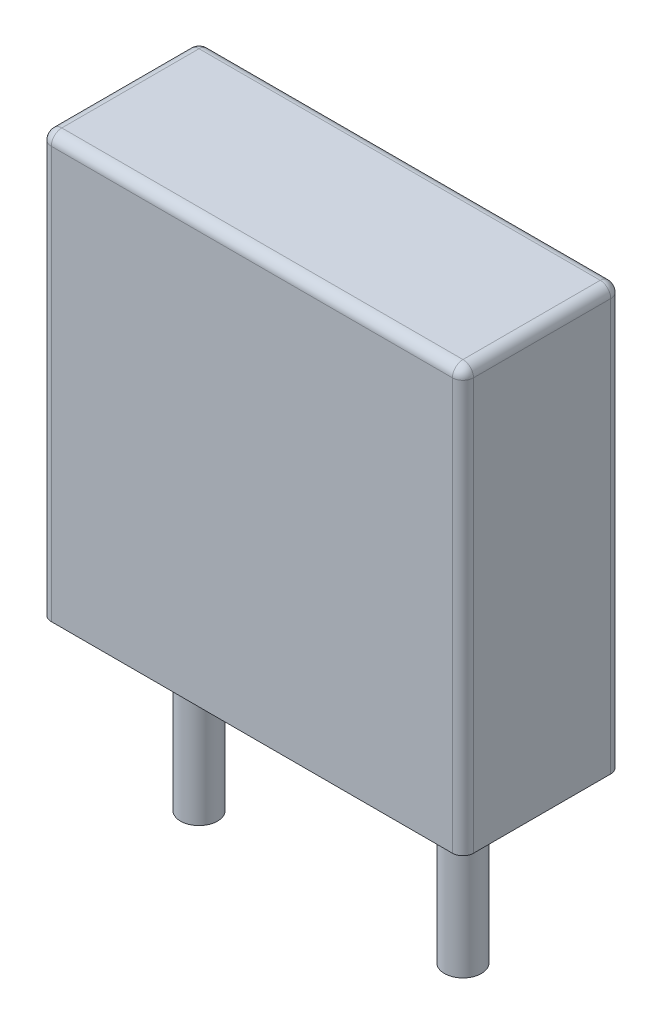
ISO-10303-21;
HEADER;
FILE_DESCRIPTION(('STEP AP214'),'2;1');
FILE_NAME('part.step','',(''),(''),'','','');
FILE_SCHEMA(('AUTOMOTIVE_DESIGN { 1 0 10303 214 1 1 1 1 }'));
ENDSEC;
DATA;
#1=APPLICATION_CONTEXT('core data for automotive mechanical design processes');
#2=APPLICATION_PROTOCOL_DEFINITION('international standard','automotive_design',2000,#1);
#3=PRODUCT_CONTEXT('',#1,'mechanical');
#4=PRODUCT('Part','Part','',(#3));
#5=PRODUCT_RELATED_PRODUCT_CATEGORY('part','',(#4));
#6=PRODUCT_DEFINITION_FORMATION('','',#4);
#7=PRODUCT_DEFINITION_CONTEXT('part definition',#1,'design');
#8=PRODUCT_DEFINITION('design','',#6,#7);
#9=PRODUCT_DEFINITION_SHAPE('','',#8);
#10=(LENGTH_UNIT() NAMED_UNIT(*) SI_UNIT(.MILLI.,.METRE.));
#11=(NAMED_UNIT(*) PLANE_ANGLE_UNIT() SI_UNIT($,.RADIAN.));
#12=(NAMED_UNIT(*) SI_UNIT($,.STERADIAN.) SOLID_ANGLE_UNIT());
#13=UNCERTAINTY_MEASURE_WITH_UNIT(LENGTH_MEASURE(1.E-05),#10,'distance_accuracy_value','');
#14=(GEOMETRIC_REPRESENTATION_CONTEXT(3) GLOBAL_UNCERTAINTY_ASSIGNED_CONTEXT((#13)) GLOBAL_UNIT_ASSIGNED_CONTEXT((#10,
#11,#12)) REPRESENTATION_CONTEXT('',''));
#15=CARTESIAN_POINT('',(0.,0.,0.));
#16=DIRECTION('',(0.,0.,1.));
#17=DIRECTION('',(1.,0.,0.));
#18=AXIS2_PLACEMENT_3D('',#15,#16,#17);
#19=CARTESIAN_POINT('',(4.,8.,1.5));
#20=DIRECTION('',(-1.,0.,0.));
#21=DIRECTION('',(0.,0.,1.));
#22=AXIS2_PLACEMENT_3D('',#19,#20,#21);
#23=PLANE('',#22);
#24=DIRECTION('',(0.,0.,-1.));
#25=VECTOR('',#24,1.);
#26=CARTESIAN_POINT('',(4.,0.,1.5));
#27=LINE('',#26,#25);
#28=CARTESIAN_POINT('',(4.,0.,1.3));
#29=VERTEX_POINT('',#28);
#30=CARTESIAN_POINT('',(4.,0.,-1.3));
#31=VERTEX_POINT('',#30);
#32=EDGE_CURVE('E251',#29,#31,#27,.T.);
#33=ORIENTED_EDGE('',*,*,#32,.T.);
#34=DIRECTION('',(0.,-1.,0.));
#35=VECTOR('',#34,1.);
#36=CARTESIAN_POINT('',(4.,8.,-1.3));
#37=LINE('',#36,#35);
#38=CARTESIAN_POINT('',(4.,7.8,-1.3));
#39=VERTEX_POINT('',#38);
#40=EDGE_CURVE('E56',#31,#39,#37,.F.);
#41=ORIENTED_EDGE('',*,*,#40,.T.);
#42=DIRECTION('',(0.,0.,-1.));
#43=VECTOR('',#42,1.);
#44=CARTESIAN_POINT('',(4.,7.8,1.5));
#45=LINE('',#44,#43);
#46=CARTESIAN_POINT('',(4.,7.8,1.3));
#47=VERTEX_POINT('',#46);
#48=EDGE_CURVE('E61',#39,#47,#45,.F.);
#49=ORIENTED_EDGE('',*,*,#48,.T.);
#50=DIRECTION('',(0.,-1.,0.));
#51=VECTOR('',#50,1.);
#52=CARTESIAN_POINT('',(4.,8.,1.3));
#53=LINE('',#52,#51);
#54=EDGE_CURVE('E187',#47,#29,#53,.T.);
#55=ORIENTED_EDGE('',*,*,#54,.T.);
#56=EDGE_LOOP('',(#33,#41,#49,#55));
#57=FACE_BOUND('',#56,.T.);
#58=ADVANCED_FACE('F38',(#57),#23,.F.);
#59=CARTESIAN_POINT('',(-4.,8.,-1.5));
#60=DIRECTION('',(0.,0.,1.));
#61=DIRECTION('',(1.,0.,0.));
#62=AXIS2_PLACEMENT_3D('',#59,#60,#61);
#63=PLANE('',#62);
#64=DIRECTION('',(-1.,0.,0.));
#65=VECTOR('',#64,1.);
#66=CARTESIAN_POINT('',(-4.,0.,-1.5));
#67=LINE('',#66,#65);
#68=CARTESIAN_POINT('',(3.8,0.,-1.5));
#69=VERTEX_POINT('',#68);
#70=CARTESIAN_POINT('',(-3.8,0.,-1.5));
#71=VERTEX_POINT('',#70);
#72=EDGE_CURVE('E257',#69,#71,#67,.T.);
#73=ORIENTED_EDGE('',*,*,#72,.T.);
#74=DIRECTION('',(0.,-1.,0.));
#75=VECTOR('',#74,1.);
#76=CARTESIAN_POINT('',(-3.8,8.,-1.5));
#77=LINE('',#76,#75);
#78=CARTESIAN_POINT('',(-3.8,7.8,-1.5));
#79=VERTEX_POINT('',#78);
#80=EDGE_CURVE('E184',#71,#79,#77,.F.);
#81=ORIENTED_EDGE('',*,*,#80,.T.);
#82=DIRECTION('',(-1.,0.,0.));
#83=VECTOR('',#82,1.);
#84=CARTESIAN_POINT('',(-4.,7.8,-1.5));
#85=LINE('',#84,#83);
#86=CARTESIAN_POINT('',(3.8,7.8,-1.5));
#87=VERTEX_POINT('',#86);
#88=EDGE_CURVE('E181',#79,#87,#85,.F.);
#89=ORIENTED_EDGE('',*,*,#88,.T.);
#90=DIRECTION('',(0.,-1.,0.));
#91=VECTOR('',#90,1.);
#92=CARTESIAN_POINT('',(3.8,8.,-1.5));
#93=LINE('',#92,#91);
#94=EDGE_CURVE('E178',#87,#69,#93,.T.);
#95=ORIENTED_EDGE('',*,*,#94,.T.);
#96=EDGE_LOOP('',(#73,#81,#89,#95));
#97=FACE_BOUND('',#96,.T.);
#98=ADVANCED_FACE('F312',(#97),#63,.F.);
#99=CARTESIAN_POINT('',(-4.,8.,1.5));
#100=DIRECTION('',(1.,0.,0.));
#101=DIRECTION('',(0.,0.,-1.));
#102=AXIS2_PLACEMENT_3D('',#99,#100,#101);
#103=PLANE('',#102);
#104=DIRECTION('',(0.,0.,1.));
#105=VECTOR('',#104,1.);
#106=CARTESIAN_POINT('',(-4.,7.8,1.5));
#107=LINE('',#106,#105);
#108=CARTESIAN_POINT('',(-4.,7.8,1.3));
#109=VERTEX_POINT('',#108);
#110=CARTESIAN_POINT('',(-4.,7.8,-1.3));
#111=VERTEX_POINT('',#110);
#112=EDGE_CURVE('E172',#109,#111,#107,.F.);
#113=ORIENTED_EDGE('',*,*,#112,.T.);
#114=DIRECTION('',(0.,-1.,0.));
#115=VECTOR('',#114,1.);
#116=CARTESIAN_POINT('',(-4.,8.,-1.3));
#117=LINE('',#116,#115);
#118=CARTESIAN_POINT('',(-4.,0.,-1.3));
#119=VERTEX_POINT('',#118);
#120=EDGE_CURVE('E175',#111,#119,#117,.T.);
#121=ORIENTED_EDGE('',*,*,#120,.T.);
#122=DIRECTION('',(0.,0.,1.));
#123=VECTOR('',#122,1.);
#124=CARTESIAN_POINT('',(-4.,0.,1.5));
#125=LINE('',#124,#123);
#126=CARTESIAN_POINT('',(-4.,0.,1.3));
#127=VERTEX_POINT('',#126);
#128=EDGE_CURVE('E261',#119,#127,#125,.T.);
#129=ORIENTED_EDGE('',*,*,#128,.T.);
#130=DIRECTION('',(0.,-1.,0.));
#131=VECTOR('',#130,1.);
#132=CARTESIAN_POINT('',(-4.,8.,1.3));
#133=LINE('',#132,#131);
#134=EDGE_CURVE('E169',#127,#109,#133,.F.);
#135=ORIENTED_EDGE('',*,*,#134,.T.);
#136=EDGE_LOOP('',(#113,#121,#129,#135));
#137=FACE_BOUND('',#136,.T.);
#138=ADVANCED_FACE('F318',(#137),#103,.F.);
#139=CARTESIAN_POINT('',(-4.,8.,1.5));
#140=DIRECTION('',(0.,0.,-1.));
#141=DIRECTION('',(-1.,0.,0.));
#142=AXIS2_PLACEMENT_3D('',#139,#140,#141);
#143=PLANE('',#142);
#144=DIRECTION('',(1.,0.,0.));
#145=VECTOR('',#144,1.);
#146=CARTESIAN_POINT('',(-4.,0.,1.5));
#147=LINE('',#146,#145);
#148=CARTESIAN_POINT('',(-3.8,0.,1.5));
#149=VERTEX_POINT('',#148);
#150=CARTESIAN_POINT('',(3.8,0.,1.5));
#151=VERTEX_POINT('',#150);
#152=EDGE_CURVE('E149',#149,#151,#147,.T.);
#153=ORIENTED_EDGE('',*,*,#152,.T.);
#154=DIRECTION('',(0.,-1.,0.));
#155=VECTOR('',#154,1.);
#156=CARTESIAN_POINT('',(3.8,8.,1.5));
#157=LINE('',#156,#155);
#158=CARTESIAN_POINT('',(3.8,7.8,1.5));
#159=VERTEX_POINT('',#158);
#160=EDGE_CURVE('E166',#151,#159,#157,.F.);
#161=ORIENTED_EDGE('',*,*,#160,.T.);
#162=DIRECTION('',(1.,0.,0.));
#163=VECTOR('',#162,1.);
#164=CARTESIAN_POINT('',(-4.,7.8,1.5));
#165=LINE('',#164,#163);
#166=CARTESIAN_POINT('',(-3.8,7.8,1.5));
#167=VERTEX_POINT('',#166);
#168=EDGE_CURVE('E124',#159,#167,#165,.F.);
#169=ORIENTED_EDGE('',*,*,#168,.T.);
#170=DIRECTION('',(0.,-1.,0.));
#171=VECTOR('',#170,1.);
#172=CARTESIAN_POINT('',(-3.8,8.,1.5));
#173=LINE('',#172,#171);
#174=EDGE_CURVE('E156',#167,#149,#173,.T.);
#175=ORIENTED_EDGE('',*,*,#174,.T.);
#176=EDGE_LOOP('',(#153,#161,#169,#175));
#177=FACE_BOUND('',#176,.T.);
#178=ADVANCED_FACE('F287',(#177),#143,.F.);
#179=CARTESIAN_POINT('',(0.,8.,0.));
#180=DIRECTION('',(0.,-1.,0.));
#181=DIRECTION('',(0.,0.,-1.));
#182=AXIS2_PLACEMENT_3D('',#179,#180,#181);
#183=PLANE('',#182);
#184=DIRECTION('',(0.,0.,1.));
#185=VECTOR('',#184,1.);
#186=CARTESIAN_POINT('',(-3.8,8.,0.));
#187=LINE('',#186,#185);
#188=CARTESIAN_POINT('',(-3.8,8.,-1.3));
#189=VERTEX_POINT('',#188);
#190=CARTESIAN_POINT('',(-3.8,8.,1.3));
#191=VERTEX_POINT('',#190);
#192=EDGE_CURVE('E153',#189,#191,#187,.T.);
#193=ORIENTED_EDGE('',*,*,#192,.T.);
#194=DIRECTION('',(1.,0.,0.));
#195=VECTOR('',#194,1.);
#196=CARTESIAN_POINT('',(0.,8.,1.3));
#197=LINE('',#196,#195);
#198=CARTESIAN_POINT('',(3.8,8.,1.3));
#199=VERTEX_POINT('',#198);
#200=EDGE_CURVE('E122',#191,#199,#197,.T.);
#201=ORIENTED_EDGE('',*,*,#200,.T.);
#202=DIRECTION('',(0.,0.,-1.));
#203=VECTOR('',#202,1.);
#204=CARTESIAN_POINT('',(3.8,8.,0.));
#205=LINE('',#204,#203);
#206=CARTESIAN_POINT('',(3.8,8.,-1.3));
#207=VERTEX_POINT('',#206);
#208=EDGE_CURVE('E141',#199,#207,#205,.T.);
#209=ORIENTED_EDGE('',*,*,#208,.T.);
#210=DIRECTION('',(-1.,0.,0.));
#211=VECTOR('',#210,1.);
#212=CARTESIAN_POINT('',(0.,8.,-1.3));
#213=LINE('',#212,#211);
#214=EDGE_CURVE('E148',#207,#189,#213,.T.);
#215=ORIENTED_EDGE('',*,*,#214,.T.);
#216=EDGE_LOOP('',(#193,#201,#209,#215));
#217=FACE_BOUND('',#216,.T.);
#218=ADVANCED_FACE('F151',(#217),#183,.F.);
#219=CARTESIAN_POINT('',(0.,0.,0.));
#220=DIRECTION('',(0.,-1.,0.));
#221=DIRECTION('',(0.,0.,-1.));
#222=AXIS2_PLACEMENT_3D('',#219,#220,#221);
#223=PLANE('',#222);
#224=CARTESIAN_POINT('',(2.5,0.,0.));
#225=DIRECTION('',(0.,-1.,0.));
#226=DIRECTION('',(0.,0.,-1.));
#227=AXIS2_PLACEMENT_3D('',#224,#225,#226);
#228=CIRCLE('',#227,0.349999999999998);
#229=CARTESIAN_POINT('',(2.5,0.,-0.349999999999998));
#230=VERTEX_POINT('',#229);
#231=EDGE_CURVE('E234',#230,#230,#228,.T.);
#232=ORIENTED_EDGE('',*,*,#231,.F.);
#233=EDGE_LOOP('',(#232));
#234=FACE_BOUND('',#233,.T.);
#235=CARTESIAN_POINT('',(-2.5,0.,0.));
#236=DIRECTION('',(0.,-1.,0.));
#237=DIRECTION('',(0.,0.,-1.));
#238=AXIS2_PLACEMENT_3D('',#235,#236,#237);
#239=CIRCLE('',#238,0.350000000000003);
#240=CARTESIAN_POINT('',(-2.5,0.,-0.350000000000003));
#241=VERTEX_POINT('',#240);
#242=EDGE_CURVE('E244',#241,#241,#239,.T.);
#243=ORIENTED_EDGE('',*,*,#242,.F.);
#244=EDGE_LOOP('',(#243));
#245=FACE_BOUND('',#244,.T.);
#246=ORIENTED_EDGE('',*,*,#128,.F.);
#247=CARTESIAN_POINT('',(-3.8,0.,-1.3));
#248=DIRECTION('',(0.,-1.,0.));
#249=DIRECTION('',(0.,0.,-1.));
#250=AXIS2_PLACEMENT_3D('',#247,#248,#249);
#251=CIRCLE('',#250,0.2);
#252=EDGE_CURVE('E11',#119,#71,#251,.T.);
#253=ORIENTED_EDGE('',*,*,#252,.T.);
#254=ORIENTED_EDGE('',*,*,#72,.F.);
#255=CARTESIAN_POINT('',(3.8,0.,-1.3));
#256=DIRECTION('',(0.,-1.,0.));
#257=DIRECTION('',(0.,0.,-1.));
#258=AXIS2_PLACEMENT_3D('',#255,#256,#257);
#259=CIRCLE('',#258,0.2);
#260=EDGE_CURVE('E48',#69,#31,#259,.T.);
#261=ORIENTED_EDGE('',*,*,#260,.T.);
#262=ORIENTED_EDGE('',*,*,#32,.F.);
#263=CARTESIAN_POINT('',(3.8,0.,1.3));
#264=DIRECTION('',(0.,-1.,0.));
#265=DIRECTION('',(0.,0.,-1.));
#266=AXIS2_PLACEMENT_3D('',#263,#264,#265);
#267=CIRCLE('',#266,0.2);
#268=EDGE_CURVE('E197',#29,#151,#267,.T.);
#269=ORIENTED_EDGE('',*,*,#268,.T.);
#270=ORIENTED_EDGE('',*,*,#152,.F.);
#271=CARTESIAN_POINT('',(-3.8,0.,1.3));
#272=DIRECTION('',(0.,-1.,0.));
#273=DIRECTION('',(0.,0.,-1.));
#274=AXIS2_PLACEMENT_3D('',#271,#272,#273);
#275=CIRCLE('',#274,0.2);
#276=EDGE_CURVE('E194',#149,#127,#275,.T.);
#277=ORIENTED_EDGE('',*,*,#276,.T.);
#278=EDGE_LOOP('',(#246,#253,#254,#261,#262,#269,#270,#277));
#279=FACE_BOUND('',#278,.T.);
#280=ADVANCED_FACE('F295',(#234,#245,#279),#223,.T.);
#281=CARTESIAN_POINT('',(-2.5,-3.2,0.));
#282=DIRECTION('',(0.,1.,0.));
#283=DIRECTION('',(0.,0.,1.));
#284=AXIS2_PLACEMENT_3D('',#281,#282,#283);
#285=CYLINDRICAL_SURFACE('',#284,0.350000000000003);
#286=CARTESIAN_POINT('',(-2.5,-3.2,0.));
#287=DIRECTION('',(0.,-1.,0.));
#288=DIRECTION('',(0.,0.,-1.));
#289=AXIS2_PLACEMENT_3D('',#286,#287,#288);
#290=CIRCLE('',#289,0.350000000000003);
#291=CARTESIAN_POINT('',(-2.5,-3.2,-0.350000000000003));
#292=VERTEX_POINT('',#291);
#293=EDGE_CURVE('E247',#292,#292,#290,.T.);
#294=ORIENTED_EDGE('',*,*,#293,.F.);
#295=EDGE_LOOP('',(#294));
#296=FACE_BOUND('',#295,.T.);
#297=ORIENTED_EDGE('',*,*,#242,.T.);
#298=EDGE_LOOP('',(#297));
#299=FACE_BOUND('',#298,.T.);
#300=ADVANCED_FACE('F430',(#296,#299),#285,.T.);
#301=CARTESIAN_POINT('',(-2.5,-3.2,0.));
#302=DIRECTION('',(0.,-1.,0.));
#303=DIRECTION('',(0.,0.,-1.));
#304=AXIS2_PLACEMENT_3D('',#301,#302,#303);
#305=PLANE('',#304);
#306=ORIENTED_EDGE('',*,*,#293,.T.);
#307=EDGE_LOOP('',(#306));
#308=FACE_BOUND('',#307,.T.);
#309=ADVANCED_FACE('F421',(#308),#305,.T.);
#310=CARTESIAN_POINT('',(2.5,-3.2,0.));
#311=DIRECTION('',(0.,1.,0.));
#312=DIRECTION('',(0.,0.,1.));
#313=AXIS2_PLACEMENT_3D('',#310,#311,#312);
#314=CYLINDRICAL_SURFACE('',#313,0.349999999999998);
#315=CARTESIAN_POINT('',(2.5,-3.2,0.));
#316=DIRECTION('',(0.,-1.,0.));
#317=DIRECTION('',(0.,0.,-1.));
#318=AXIS2_PLACEMENT_3D('',#315,#316,#317);
#319=CIRCLE('',#318,0.349999999999998);
#320=CARTESIAN_POINT('',(2.5,-3.2,-0.349999999999998));
#321=VERTEX_POINT('',#320);
#322=EDGE_CURVE('E238',#321,#321,#319,.T.);
#323=ORIENTED_EDGE('',*,*,#322,.F.);
#324=EDGE_LOOP('',(#323));
#325=FACE_BOUND('',#324,.T.);
#326=ORIENTED_EDGE('',*,*,#231,.T.);
#327=EDGE_LOOP('',(#326));
#328=FACE_BOUND('',#327,.T.);
#329=ADVANCED_FACE('F412',(#325,#328),#314,.T.);
#330=CARTESIAN_POINT('',(2.5,-3.2,0.));
#331=DIRECTION('',(0.,-1.,0.));
#332=DIRECTION('',(0.,0.,-1.));
#333=AXIS2_PLACEMENT_3D('',#330,#331,#332);
#334=PLANE('',#333);
#335=ORIENTED_EDGE('',*,*,#322,.T.);
#336=EDGE_LOOP('',(#335));
#337=FACE_BOUND('',#336,.T.);
#338=ADVANCED_FACE('F404',(#337),#334,.T.);
#339=CARTESIAN_POINT('',(-3.8,8.,-1.3));
#340=DIRECTION('',(0.,-1.,0.));
#341=DIRECTION('',(0.,0.,-1.));
#342=AXIS2_PLACEMENT_3D('',#339,#340,#341);
#343=CYLINDRICAL_SURFACE('',#342,0.2);
#344=ORIENTED_EDGE('',*,*,#252,.F.);
#345=ORIENTED_EDGE('',*,*,#120,.F.);
#346=CARTESIAN_POINT('',(-3.8,7.8,-1.3));
#347=DIRECTION('',(0.,1.,0.));
#348=DIRECTION('',(0.,0.,1.));
#349=AXIS2_PLACEMENT_3D('',#346,#347,#348);
#350=CIRCLE('',#349,0.2);
#351=EDGE_CURVE('E42',#79,#111,#350,.T.);
#352=ORIENTED_EDGE('',*,*,#351,.F.);
#353=ORIENTED_EDGE('',*,*,#80,.F.);
#354=EDGE_LOOP('',(#344,#345,#352,#353));
#355=FACE_BOUND('',#354,.T.);
#356=ADVANCED_FACE('F40',(#355),#343,.T.);
#357=CARTESIAN_POINT('',(0.,7.8,-1.3));
#358=DIRECTION('',(-1.,0.,0.));
#359=DIRECTION('',(0.,0.,1.));
#360=AXIS2_PLACEMENT_3D('',#357,#358,#359);
#361=CYLINDRICAL_SURFACE('',#360,0.2);
#362=CARTESIAN_POINT('',(3.8,7.8,-1.3));
#363=DIRECTION('',(1.,0.,0.));
#364=DIRECTION('',(0.,1.,0.));
#365=AXIS2_PLACEMENT_3D('',#362,#363,#364);
#366=CIRCLE('',#365,0.2);
#367=EDGE_CURVE('E223',#87,#207,#366,.T.);
#368=ORIENTED_EDGE('',*,*,#367,.F.);
#369=ORIENTED_EDGE('',*,*,#88,.F.);
#370=CARTESIAN_POINT('',(-3.8,7.8,-1.3));
#371=DIRECTION('',(-1.,0.,0.));
#372=DIRECTION('',(0.,0.,1.));
#373=AXIS2_PLACEMENT_3D('',#370,#371,#372);
#374=CIRCLE('',#373,0.2);
#375=EDGE_CURVE('E226',#189,#79,#374,.T.);
#376=ORIENTED_EDGE('',*,*,#375,.F.);
#377=ORIENTED_EDGE('',*,*,#214,.F.);
#378=EDGE_LOOP('',(#368,#369,#376,#377));
#379=FACE_BOUND('',#378,.T.);
#380=ADVANCED_FACE('F271',(#379),#361,.T.);
#381=CARTESIAN_POINT('',(3.8,8.,-1.3));
#382=DIRECTION('',(0.,-1.,0.));
#383=DIRECTION('',(0.,0.,-1.));
#384=AXIS2_PLACEMENT_3D('',#381,#382,#383);
#385=CYLINDRICAL_SURFACE('',#384,0.2);
#386=ORIENTED_EDGE('',*,*,#260,.F.);
#387=ORIENTED_EDGE('',*,*,#94,.F.);
#388=CARTESIAN_POINT('',(3.8,7.8,-1.3));
#389=DIRECTION('',(0.,1.,0.));
#390=DIRECTION('',(0.,0.,1.));
#391=AXIS2_PLACEMENT_3D('',#388,#389,#390);
#392=CIRCLE('',#391,0.2);
#393=EDGE_CURVE('E219',#39,#87,#392,.T.);
#394=ORIENTED_EDGE('',*,*,#393,.F.);
#395=ORIENTED_EDGE('',*,*,#40,.F.);
#396=EDGE_LOOP('',(#386,#387,#394,#395));
#397=FACE_BOUND('',#396,.T.);
#398=ADVANCED_FACE('F300',(#397),#385,.T.);
#399=CARTESIAN_POINT('',(-3.8,7.8,-1.3));
#400=DIRECTION('',(0.,0.,1.));
#401=DIRECTION('',(1.,0.,0.));
#402=AXIS2_PLACEMENT_3D('',#399,#400,#401);
#403=SPHERICAL_SURFACE('',#402,0.2);
#404=ORIENTED_EDGE('',*,*,#375,.T.);
#405=ORIENTED_EDGE('',*,*,#351,.T.);
#406=CARTESIAN_POINT('',(-3.8,7.8,-1.3));
#407=DIRECTION('',(0.,0.,-1.));
#408=DIRECTION('',(-1.,0.,0.));
#409=AXIS2_PLACEMENT_3D('',#406,#407,#408);
#410=CIRCLE('',#409,0.2);
#411=EDGE_CURVE('E215',#189,#111,#410,.F.);
#412=ORIENTED_EDGE('',*,*,#411,.F.);
#413=EDGE_LOOP('',(#404,#405,#412));
#414=FACE_BOUND('',#413,.T.);
#415=ADVANCED_FACE('F272',(#414),#403,.T.);
#416=CARTESIAN_POINT('',(3.8,7.8,-1.3));
#417=DIRECTION('',(0.,0.,1.));
#418=DIRECTION('',(1.,0.,0.));
#419=AXIS2_PLACEMENT_3D('',#416,#417,#418);
#420=SPHERICAL_SURFACE('',#419,0.2);
#421=ORIENTED_EDGE('',*,*,#393,.T.);
#422=ORIENTED_EDGE('',*,*,#367,.T.);
#423=CARTESIAN_POINT('',(3.8,7.8,-1.3));
#424=DIRECTION('',(0.,0.,-1.));
#425=DIRECTION('',(-1.,0.,0.));
#426=AXIS2_PLACEMENT_3D('',#423,#424,#425);
#427=CIRCLE('',#426,0.2);
#428=EDGE_CURVE('E144',#39,#207,#427,.F.);
#429=ORIENTED_EDGE('',*,*,#428,.F.);
#430=EDGE_LOOP('',(#421,#422,#429));
#431=FACE_BOUND('',#430,.T.);
#432=ADVANCED_FACE('F302',(#431),#420,.T.);
#433=CARTESIAN_POINT('',(-3.8,8.,1.3));
#434=DIRECTION('',(0.,-1.,0.));
#435=DIRECTION('',(0.,0.,-1.));
#436=AXIS2_PLACEMENT_3D('',#433,#434,#435);
#437=CYLINDRICAL_SURFACE('',#436,0.2);
#438=ORIENTED_EDGE('',*,*,#276,.F.);
#439=ORIENTED_EDGE('',*,*,#174,.F.);
#440=CARTESIAN_POINT('',(-3.8,7.8,1.3));
#441=DIRECTION('',(0.,1.,0.));
#442=DIRECTION('',(0.,0.,1.));
#443=AXIS2_PLACEMENT_3D('',#440,#441,#442);
#444=CIRCLE('',#443,0.2);
#445=EDGE_CURVE('E209',#109,#167,#444,.T.);
#446=ORIENTED_EDGE('',*,*,#445,.F.);
#447=ORIENTED_EDGE('',*,*,#134,.F.);
#448=EDGE_LOOP('',(#438,#439,#446,#447));
#449=FACE_BOUND('',#448,.T.);
#450=ADVANCED_FACE('F284',(#449),#437,.T.);
#451=CARTESIAN_POINT('',(-3.8,7.8,0.));
#452=DIRECTION('',(0.,0.,1.));
#453=DIRECTION('',(1.,0.,0.));
#454=AXIS2_PLACEMENT_3D('',#451,#452,#453);
#455=CYLINDRICAL_SURFACE('',#454,0.2);
#456=ORIENTED_EDGE('',*,*,#411,.T.);
#457=ORIENTED_EDGE('',*,*,#112,.F.);
#458=CARTESIAN_POINT('',(-3.8,7.8,1.3));
#459=DIRECTION('',(0.,0.,1.));
#460=DIRECTION('',(1.,0.,0.));
#461=AXIS2_PLACEMENT_3D('',#458,#459,#460);
#462=CIRCLE('',#461,0.2);
#463=EDGE_CURVE('E138',#191,#109,#462,.T.);
#464=ORIENTED_EDGE('',*,*,#463,.F.);
#465=ORIENTED_EDGE('',*,*,#192,.F.);
#466=EDGE_LOOP('',(#456,#457,#464,#465));
#467=FACE_BOUND('',#466,.T.);
#468=ADVANCED_FACE('F275',(#467),#455,.T.);
#469=CARTESIAN_POINT('',(3.8,7.8,0.));
#470=DIRECTION('',(0.,0.,-1.));
#471=DIRECTION('',(-1.,0.,0.));
#472=AXIS2_PLACEMENT_3D('',#469,#470,#471);
#473=CYLINDRICAL_SURFACE('',#472,0.2);
#474=ORIENTED_EDGE('',*,*,#428,.T.);
#475=ORIENTED_EDGE('',*,*,#208,.F.);
#476=CARTESIAN_POINT('',(3.8,7.8,1.3));
#477=DIRECTION('',(0.,0.,1.));
#478=DIRECTION('',(1.,0.,0.));
#479=AXIS2_PLACEMENT_3D('',#476,#477,#478);
#480=CIRCLE('',#479,0.2);
#481=EDGE_CURVE('E131',#47,#199,#480,.T.);
#482=ORIENTED_EDGE('',*,*,#481,.F.);
#483=ORIENTED_EDGE('',*,*,#48,.F.);
#484=EDGE_LOOP('',(#474,#475,#482,#483));
#485=FACE_BOUND('',#484,.T.);
#486=ADVANCED_FACE('F142',(#485),#473,.T.);
#487=CARTESIAN_POINT('',(3.8,8.,1.3));
#488=DIRECTION('',(0.,-1.,0.));
#489=DIRECTION('',(0.,0.,-1.));
#490=AXIS2_PLACEMENT_3D('',#487,#488,#489);
#491=CYLINDRICAL_SURFACE('',#490,0.2);
#492=ORIENTED_EDGE('',*,*,#268,.F.);
#493=ORIENTED_EDGE('',*,*,#54,.F.);
#494=CARTESIAN_POINT('',(3.8,7.8,1.3));
#495=DIRECTION('',(0.,1.,0.));
#496=DIRECTION('',(0.,0.,1.));
#497=AXIS2_PLACEMENT_3D('',#494,#495,#496);
#498=CIRCLE('',#497,0.2);
#499=EDGE_CURVE('E135',#159,#47,#498,.T.);
#500=ORIENTED_EDGE('',*,*,#499,.F.);
#501=ORIENTED_EDGE('',*,*,#160,.F.);
#502=EDGE_LOOP('',(#492,#493,#500,#501));
#503=FACE_BOUND('',#502,.T.);
#504=ADVANCED_FACE('F291',(#503),#491,.T.);
#505=CARTESIAN_POINT('',(-3.8,7.8,1.3));
#506=DIRECTION('',(0.,0.,1.));
#507=DIRECTION('',(1.,0.,0.));
#508=AXIS2_PLACEMENT_3D('',#505,#506,#507);
#509=SPHERICAL_SURFACE('',#508,0.2);
#510=ORIENTED_EDGE('',*,*,#463,.T.);
#511=ORIENTED_EDGE('',*,*,#445,.T.);
#512=CARTESIAN_POINT('',(-3.8,7.8,1.3));
#513=DIRECTION('',(-1.,0.,0.));
#514=DIRECTION('',(0.,0.,1.));
#515=AXIS2_PLACEMENT_3D('',#512,#513,#514);
#516=CIRCLE('',#515,0.2);
#517=EDGE_CURVE('E128',#191,#167,#516,.F.);
#518=ORIENTED_EDGE('',*,*,#517,.F.);
#519=EDGE_LOOP('',(#510,#511,#518));
#520=FACE_BOUND('',#519,.T.);
#521=ADVANCED_FACE('F279',(#520),#509,.T.);
#522=CARTESIAN_POINT('',(3.8,7.8,1.3));
#523=DIRECTION('',(0.,0.,1.));
#524=DIRECTION('',(1.,0.,0.));
#525=AXIS2_PLACEMENT_3D('',#522,#523,#524);
#526=SPHERICAL_SURFACE('',#525,0.2);
#527=ORIENTED_EDGE('',*,*,#499,.T.);
#528=ORIENTED_EDGE('',*,*,#481,.T.);
#529=CARTESIAN_POINT('',(3.8,7.8,1.3));
#530=DIRECTION('',(1.,0.,0.));
#531=DIRECTION('',(0.,0.,-1.));
#532=AXIS2_PLACEMENT_3D('',#529,#530,#531);
#533=CIRCLE('',#532,0.2);
#534=EDGE_CURVE('E118',#159,#199,#533,.F.);
#535=ORIENTED_EDGE('',*,*,#534,.F.);
#536=EDGE_LOOP('',(#527,#528,#535));
#537=FACE_BOUND('',#536,.T.);
#538=ADVANCED_FACE('F133',(#537),#526,.T.);
#539=CARTESIAN_POINT('',(0.,7.8,1.3));
#540=DIRECTION('',(1.,0.,0.));
#541=DIRECTION('',(0.,0.,-1.));
#542=AXIS2_PLACEMENT_3D('',#539,#540,#541);
#543=CYLINDRICAL_SURFACE('',#542,0.2);
#544=ORIENTED_EDGE('',*,*,#517,.T.);
#545=ORIENTED_EDGE('',*,*,#168,.F.);
#546=ORIENTED_EDGE('',*,*,#534,.T.);
#547=ORIENTED_EDGE('',*,*,#200,.F.);
#548=EDGE_LOOP('',(#544,#545,#546,#547));
#549=FACE_BOUND('',#548,.T.);
#550=ADVANCED_FACE('F120',(#549),#543,.T.);
#551=CLOSED_SHELL('',(#58,#98,#138,#178,#218,#280,#300,#309,#329,#338,#356,#380,#398,#415,#432,
#450,#468,#486,#504,#521,#538,#550));
#552=MANIFOLD_SOLID_BREP('B2',#551);
#553=ADVANCED_BREP_SHAPE_REPRESENTATION('',(#18,#552),#14);
#554=SHAPE_DEFINITION_REPRESENTATION(#9,#553);
ENDSEC;
END-ISO-10303-21;
